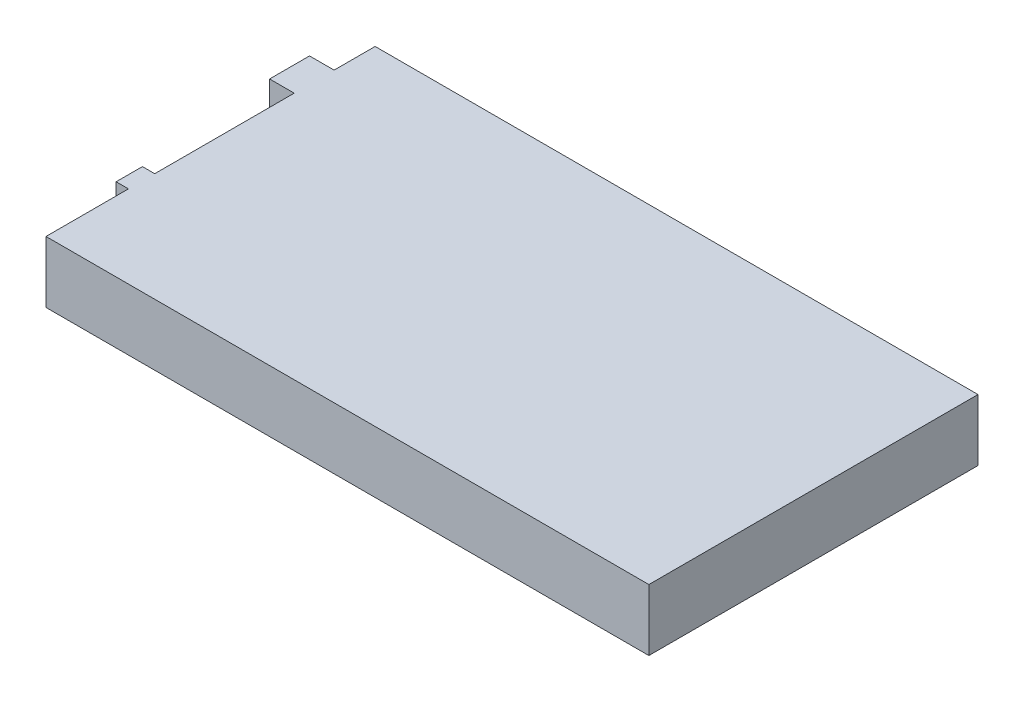
ISO-10303-21;
HEADER;
FILE_DESCRIPTION(('STEP AP214'),'2;1');
FILE_NAME('part.step','',(''),(''),'','','');
FILE_SCHEMA(('AUTOMOTIVE_DESIGN { 1 0 10303 214 1 1 1 1 }'));
ENDSEC;
DATA;
#1=APPLICATION_CONTEXT('core data for automotive mechanical design processes');
#2=APPLICATION_PROTOCOL_DEFINITION('international standard','automotive_design',2000,#1);
#3=PRODUCT_CONTEXT('',#1,'mechanical');
#4=PRODUCT('Part','Part','',(#3));
#5=PRODUCT_RELATED_PRODUCT_CATEGORY('part','',(#4));
#6=PRODUCT_DEFINITION_FORMATION('','',#4);
#7=PRODUCT_DEFINITION_CONTEXT('part definition',#1,'design');
#8=PRODUCT_DEFINITION('design','',#6,#7);
#9=PRODUCT_DEFINITION_SHAPE('','',#8);
#10=(LENGTH_UNIT() NAMED_UNIT(*) SI_UNIT(.MILLI.,.METRE.));
#11=(NAMED_UNIT(*) PLANE_ANGLE_UNIT() SI_UNIT($,.RADIAN.));
#12=(NAMED_UNIT(*) SI_UNIT($,.STERADIAN.) SOLID_ANGLE_UNIT());
#13=UNCERTAINTY_MEASURE_WITH_UNIT(LENGTH_MEASURE(1.E-05),#10,'distance_accuracy_value','');
#14=(GEOMETRIC_REPRESENTATION_CONTEXT(3) GLOBAL_UNCERTAINTY_ASSIGNED_CONTEXT((#13)) GLOBAL_UNIT_ASSIGNED_CONTEXT((#10,
#11,#12)) REPRESENTATION_CONTEXT('',''));
#15=CARTESIAN_POINT('',(0.,0.,0.));
#16=DIRECTION('',(0.,0.,1.));
#17=DIRECTION('',(1.,0.,0.));
#18=AXIS2_PLACEMENT_3D('',#15,#16,#17);
#19=CARTESIAN_POINT('',(-49.,10.,-26.75));
#20=DIRECTION('',(1.,0.,0.));
#21=DIRECTION('',(0.,0.,-1.));
#22=AXIS2_PLACEMENT_3D('',#19,#20,#21);
#23=PLANE('',#22);
#24=DIRECTION('',(0.,0.,1.));
#25=VECTOR('',#24,1.);
#26=CARTESIAN_POINT('',(-49.,0.,-26.75));
#27=LINE('',#26,#25);
#28=CARTESIAN_POINT('',(-49.,0.,-13.5956084483653));
#29=VERTEX_POINT('',#28);
#30=CARTESIAN_POINT('',(-49.,0.,9.07743041416528));
#31=VERTEX_POINT('',#30);
#32=EDGE_CURVE('E234',#29,#31,#27,.T.);
#33=ORIENTED_EDGE('',*,*,#32,.T.);
#34=DIRECTION('',(0.,1.,0.));
#35=VECTOR('',#34,1.);
#36=CARTESIAN_POINT('',(-49.,10.,9.07743041416529));
#37=LINE('',#36,#35);
#38=CARTESIAN_POINT('',(-49.,10.,9.07743041416528));
#39=VERTEX_POINT('',#38);
#40=EDGE_CURVE('E63',#31,#39,#37,.T.);
#41=ORIENTED_EDGE('',*,*,#40,.T.);
#42=DIRECTION('',(0.,0.,1.));
#43=VECTOR('',#42,1.);
#44=CARTESIAN_POINT('',(-49.,10.,-26.75));
#45=LINE('',#44,#43);
#46=CARTESIAN_POINT('',(-49.,10.,-13.5956084483653));
#47=VERTEX_POINT('',#46);
#48=EDGE_CURVE('E220',#47,#39,#45,.T.);
#49=ORIENTED_EDGE('',*,*,#48,.F.);
#50=DIRECTION('',(0.,-1.,0.));
#51=VECTOR('',#50,1.);
#52=CARTESIAN_POINT('',(-49.,10.,-13.5956084483653));
#53=LINE('',#52,#51);
#54=EDGE_CURVE('E202',#47,#29,#53,.T.);
#55=ORIENTED_EDGE('',*,*,#54,.T.);
#56=EDGE_LOOP('',(#33,#41,#49,#55));
#57=FACE_BOUND('',#56,.T.);
#58=ADVANCED_FACE('F39',(#57),#23,.F.);
#59=CARTESIAN_POINT('',(-49.,10.,13.3491623737725));
#60=VERTEX_POINT('',#59);
#61=CARTESIAN_POINT('',(-49.,10.,26.75));
#62=VERTEX_POINT('',#61);
#63=EDGE_CURVE('E55',#60,#62,#45,.T.);
#64=ORIENTED_EDGE('',*,*,#63,.F.);
#65=DIRECTION('',(0.,-1.,0.));
#66=VECTOR('',#65,1.);
#67=CARTESIAN_POINT('',(-49.,10.,13.3491623737725));
#68=LINE('',#67,#66);
#69=CARTESIAN_POINT('',(-49.,0.,13.3491623737725));
#70=VERTEX_POINT('',#69);
#71=EDGE_CURVE('E147',#60,#70,#68,.T.);
#72=ORIENTED_EDGE('',*,*,#71,.T.);
#73=CARTESIAN_POINT('',(-49.,0.,26.75));
#74=VERTEX_POINT('',#73);
#75=EDGE_CURVE('E230',#70,#74,#27,.T.);
#76=ORIENTED_EDGE('',*,*,#75,.T.);
#77=DIRECTION('',(0.,-1.,0.));
#78=VECTOR('',#77,1.);
#79=CARTESIAN_POINT('',(-49.,10.,26.75));
#80=LINE('',#79,#78);
#81=EDGE_CURVE('E240',#62,#74,#80,.T.);
#82=ORIENTED_EDGE('',*,*,#81,.F.);
#83=EDGE_LOOP('',(#64,#72,#76,#82));
#84=FACE_BOUND('',#83,.T.);
#85=ADVANCED_FACE('F271',(#84),#23,.F.);
#86=CARTESIAN_POINT('',(49.,10.,-26.75));
#87=DIRECTION('',(-1.,0.,0.));
#88=DIRECTION('',(0.,0.,1.));
#89=AXIS2_PLACEMENT_3D('',#86,#87,#88);
#90=PLANE('',#89);
#91=DIRECTION('',(0.,0.,-1.));
#92=VECTOR('',#91,1.);
#93=CARTESIAN_POINT('',(49.,0.,-26.75));
#94=LINE('',#93,#92);
#95=CARTESIAN_POINT('',(49.,0.,26.75));
#96=VERTEX_POINT('',#95);
#97=CARTESIAN_POINT('',(49.,0.,-26.75));
#98=VERTEX_POINT('',#97);
#99=EDGE_CURVE('E206',#96,#98,#94,.T.);
#100=ORIENTED_EDGE('',*,*,#99,.T.);
#101=DIRECTION('',(0.,-1.,0.));
#102=VECTOR('',#101,1.);
#103=CARTESIAN_POINT('',(49.,10.,-26.75));
#104=LINE('',#103,#102);
#105=CARTESIAN_POINT('',(49.,10.,-26.75));
#106=VERTEX_POINT('',#105);
#107=EDGE_CURVE('E11',#106,#98,#104,.T.);
#108=ORIENTED_EDGE('',*,*,#107,.F.);
#109=DIRECTION('',(0.,0.,-1.));
#110=VECTOR('',#109,1.);
#111=CARTESIAN_POINT('',(49.,10.,-26.75));
#112=LINE('',#111,#110);
#113=CARTESIAN_POINT('',(49.,10.,26.75));
#114=VERTEX_POINT('',#113);
#115=EDGE_CURVE('E207',#114,#106,#112,.T.);
#116=ORIENTED_EDGE('',*,*,#115,.F.);
#117=DIRECTION('',(0.,-1.,0.));
#118=VECTOR('',#117,1.);
#119=CARTESIAN_POINT('',(49.,10.,26.75));
#120=LINE('',#119,#118);
#121=EDGE_CURVE('E223',#114,#96,#120,.T.);
#122=ORIENTED_EDGE('',*,*,#121,.T.);
#123=EDGE_LOOP('',(#100,#108,#116,#122));
#124=FACE_BOUND('',#123,.T.);
#125=ADVANCED_FACE('F41',(#124),#90,.F.);
#126=CARTESIAN_POINT('',(-49.,10.,-26.75));
#127=DIRECTION('',(0.,0.,1.));
#128=DIRECTION('',(1.,0.,0.));
#129=AXIS2_PLACEMENT_3D('',#126,#127,#128);
#130=PLANE('',#129);
#131=DIRECTION('',(-1.,0.,0.));
#132=VECTOR('',#131,1.);
#133=CARTESIAN_POINT('',(-49.,0.,-26.75));
#134=LINE('',#133,#132);
#135=CARTESIAN_POINT('',(-49.,0.,-26.75));
#136=VERTEX_POINT('',#135);
#137=EDGE_CURVE('E227',#98,#136,#134,.T.);
#138=ORIENTED_EDGE('',*,*,#137,.T.);
#139=DIRECTION('',(0.,-1.,0.));
#140=VECTOR('',#139,1.);
#141=CARTESIAN_POINT('',(-49.,10.,-26.75));
#142=LINE('',#141,#140);
#143=CARTESIAN_POINT('',(-49.,10.,-26.75));
#144=VERTEX_POINT('',#143);
#145=EDGE_CURVE('E48',#144,#136,#142,.T.);
#146=ORIENTED_EDGE('',*,*,#145,.F.);
#147=DIRECTION('',(-1.,0.,0.));
#148=VECTOR('',#147,1.);
#149=CARTESIAN_POINT('',(-49.,10.,-26.75));
#150=LINE('',#149,#148);
#151=EDGE_CURVE('E211',#106,#144,#150,.T.);
#152=ORIENTED_EDGE('',*,*,#151,.F.);
#153=ORIENTED_EDGE('',*,*,#107,.T.);
#154=EDGE_LOOP('',(#138,#146,#152,#153));
#155=FACE_BOUND('',#154,.T.);
#156=ADVANCED_FACE('F264',(#155),#130,.F.);
#157=CARTESIAN_POINT('',(-49.,0.,-20.0853550793071));
#158=VERTEX_POINT('',#157);
#159=EDGE_CURVE('E231',#136,#158,#27,.T.);
#160=ORIENTED_EDGE('',*,*,#159,.T.);
#161=DIRECTION('',(0.,1.,0.));
#162=VECTOR('',#161,1.);
#163=CARTESIAN_POINT('',(-49.,10.,-20.085355079307));
#164=LINE('',#163,#162);
#165=CARTESIAN_POINT('',(-49.,10.,-20.0853550793071));
#166=VERTEX_POINT('',#165);
#167=EDGE_CURVE('E199',#158,#166,#164,.T.);
#168=ORIENTED_EDGE('',*,*,#167,.T.);
#169=EDGE_CURVE('E215',#144,#166,#45,.T.);
#170=ORIENTED_EDGE('',*,*,#169,.F.);
#171=ORIENTED_EDGE('',*,*,#145,.T.);
#172=EDGE_LOOP('',(#160,#168,#170,#171));
#173=FACE_BOUND('',#172,.T.);
#174=ADVANCED_FACE('F249',(#173),#23,.F.);
#175=CARTESIAN_POINT('',(-49.,10.,26.75));
#176=DIRECTION('',(0.,0.,-1.));
#177=DIRECTION('',(-1.,0.,0.));
#178=AXIS2_PLACEMENT_3D('',#175,#176,#177);
#179=PLANE('',#178);
#180=DIRECTION('',(1.,0.,0.));
#181=VECTOR('',#180,1.);
#182=CARTESIAN_POINT('',(-49.,0.,26.75));
#183=LINE('',#182,#181);
#184=EDGE_CURVE('E212',#74,#96,#183,.T.);
#185=ORIENTED_EDGE('',*,*,#184,.T.);
#186=ORIENTED_EDGE('',*,*,#121,.F.);
#187=DIRECTION('',(1.,0.,0.));
#188=VECTOR('',#187,1.);
#189=CARTESIAN_POINT('',(-49.,10.,26.75));
#190=LINE('',#189,#188);
#191=EDGE_CURVE('E219',#62,#114,#190,.T.);
#192=ORIENTED_EDGE('',*,*,#191,.F.);
#193=ORIENTED_EDGE('',*,*,#81,.T.);
#194=EDGE_LOOP('',(#185,#186,#192,#193));
#195=FACE_BOUND('',#194,.T.);
#196=ADVANCED_FACE('F269',(#195),#179,.F.);
#197=CARTESIAN_POINT('',(0.,10.,0.));
#198=DIRECTION('',(0.,1.,0.));
#199=DIRECTION('',(0.,0.,1.));
#200=AXIS2_PLACEMENT_3D('',#197,#198,#199);
#201=PLANE('',#200);
#202=ORIENTED_EDGE('',*,*,#48,.T.);
#203=DIRECTION('',(-1.,0.,0.));
#204=VECTOR('',#203,1.);
#205=CARTESIAN_POINT('',(-51.,10.,9.07743041416529));
#206=LINE('',#205,#204);
#207=CARTESIAN_POINT('',(-51.,10.,9.07743041416529));
#208=VERTEX_POINT('',#207);
#209=EDGE_CURVE('E142',#39,#208,#206,.T.);
#210=ORIENTED_EDGE('',*,*,#209,.T.);
#211=DIRECTION('',(0.,0.,1.));
#212=VECTOR('',#211,1.);
#213=CARTESIAN_POINT('',(-51.,10.,9.07743041416529));
#214=LINE('',#213,#212);
#215=CARTESIAN_POINT('',(-51.,10.,13.3491623737725));
#216=VERTEX_POINT('',#215);
#217=EDGE_CURVE('E136',#208,#216,#214,.T.);
#218=ORIENTED_EDGE('',*,*,#217,.T.);
#219=DIRECTION('',(1.,0.,0.));
#220=VECTOR('',#219,1.);
#221=CARTESIAN_POINT('',(-51.,10.,13.3491623737725));
#222=LINE('',#221,#220);
#223=EDGE_CURVE('E145',#216,#60,#222,.T.);
#224=ORIENTED_EDGE('',*,*,#223,.T.);
#225=ORIENTED_EDGE('',*,*,#63,.T.);
#226=ORIENTED_EDGE('',*,*,#191,.T.);
#227=ORIENTED_EDGE('',*,*,#115,.T.);
#228=ORIENTED_EDGE('',*,*,#151,.T.);
#229=ORIENTED_EDGE('',*,*,#169,.T.);
#230=DIRECTION('',(-1.,0.,0.));
#231=VECTOR('',#230,1.);
#232=CARTESIAN_POINT('',(-42.2385214094511,10.,-20.085355079307));
#233=LINE('',#232,#231);
#234=CARTESIAN_POINT('',(-53.,10.,-20.085355079307));
#235=VERTEX_POINT('',#234);
#236=EDGE_CURVE('E171',#166,#235,#233,.T.);
#237=ORIENTED_EDGE('',*,*,#236,.T.);
#238=DIRECTION('',(0.,0.,1.));
#239=VECTOR('',#238,1.);
#240=CARTESIAN_POINT('',(-53.,10.,-20.085355079307));
#241=LINE('',#240,#239);
#242=CARTESIAN_POINT('',(-53.,10.,-13.5956084483653));
#243=VERTEX_POINT('',#242);
#244=EDGE_CURVE('E182',#235,#243,#241,.T.);
#245=ORIENTED_EDGE('',*,*,#244,.T.);
#246=DIRECTION('',(1.,0.,0.));
#247=VECTOR('',#246,1.);
#248=CARTESIAN_POINT('',(-42.2385214094511,10.,-13.5956084483653));
#249=LINE('',#248,#247);
#250=EDGE_CURVE('E186',#243,#47,#249,.T.);
#251=ORIENTED_EDGE('',*,*,#250,.T.);
#252=EDGE_LOOP('',(#202,#210,#218,#224,#225,#226,#227,#228,#229,#237,#245,#251));
#253=FACE_BOUND('',#252,.T.);
#254=ADVANCED_FACE('F151',(#253),#201,.T.);
#255=CARTESIAN_POINT('',(0.,0.,0.));
#256=DIRECTION('',(0.,1.,0.));
#257=DIRECTION('',(0.,0.,1.));
#258=AXIS2_PLACEMENT_3D('',#255,#256,#257);
#259=PLANE('',#258);
#260=ORIENTED_EDGE('',*,*,#75,.F.);
#261=DIRECTION('',(-1.,0.,0.));
#262=VECTOR('',#261,1.);
#263=CARTESIAN_POINT('',(-51.,0.,13.3491623737725));
#264=LINE('',#263,#262);
#265=CARTESIAN_POINT('',(-51.,0.,13.3491623737725));
#266=VERTEX_POINT('',#265);
#267=EDGE_CURVE('E164',#70,#266,#264,.T.);
#268=ORIENTED_EDGE('',*,*,#267,.T.);
#269=DIRECTION('',(0.,0.,-1.));
#270=VECTOR('',#269,1.);
#271=CARTESIAN_POINT('',(-51.,0.,9.07743041416529));
#272=LINE('',#271,#270);
#273=CARTESIAN_POINT('',(-51.,0.,9.07743041416529));
#274=VERTEX_POINT('',#273);
#275=EDGE_CURVE('E137',#266,#274,#272,.T.);
#276=ORIENTED_EDGE('',*,*,#275,.T.);
#277=DIRECTION('',(1.,0.,0.));
#278=VECTOR('',#277,1.);
#279=CARTESIAN_POINT('',(-51.,0.,9.07743041416529));
#280=LINE('',#279,#278);
#281=EDGE_CURVE('E162',#274,#31,#280,.T.);
#282=ORIENTED_EDGE('',*,*,#281,.T.);
#283=ORIENTED_EDGE('',*,*,#32,.F.);
#284=DIRECTION('',(-1.,0.,0.));
#285=VECTOR('',#284,1.);
#286=CARTESIAN_POINT('',(-42.2385214094511,0.,-13.5956084483653));
#287=LINE('',#286,#285);
#288=CARTESIAN_POINT('',(-53.,0.,-13.5956084483653));
#289=VERTEX_POINT('',#288);
#290=EDGE_CURVE('E175',#29,#289,#287,.T.);
#291=ORIENTED_EDGE('',*,*,#290,.T.);
#292=DIRECTION('',(0.,0.,-1.));
#293=VECTOR('',#292,1.);
#294=CARTESIAN_POINT('',(-53.,0.,-20.085355079307));
#295=LINE('',#294,#293);
#296=CARTESIAN_POINT('',(-53.,0.,-20.085355079307));
#297=VERTEX_POINT('',#296);
#298=EDGE_CURVE('E172',#289,#297,#295,.T.);
#299=ORIENTED_EDGE('',*,*,#298,.T.);
#300=DIRECTION('',(1.,0.,0.));
#301=VECTOR('',#300,1.);
#302=CARTESIAN_POINT('',(-42.2385214094511,0.,-20.085355079307));
#303=LINE('',#302,#301);
#304=EDGE_CURVE('E179',#297,#158,#303,.T.);
#305=ORIENTED_EDGE('',*,*,#304,.T.);
#306=ORIENTED_EDGE('',*,*,#159,.F.);
#307=ORIENTED_EDGE('',*,*,#137,.F.);
#308=ORIENTED_EDGE('',*,*,#99,.F.);
#309=ORIENTED_EDGE('',*,*,#184,.F.);
#310=EDGE_LOOP('',(#260,#268,#276,#282,#283,#291,#299,#305,#306,#307,#308,#309));
#311=FACE_BOUND('',#310,.T.);
#312=ADVANCED_FACE('F253',(#311),#259,.F.);
#313=CARTESIAN_POINT('',(-42.2385214094511,-12.5668704452884,-13.5956084483653));
#314=DIRECTION('',(0.,0.,1.));
#315=DIRECTION('',(1.,0.,0.));
#316=AXIS2_PLACEMENT_3D('',#313,#314,#315);
#317=PLANE('',#316);
#318=ORIENTED_EDGE('',*,*,#54,.F.);
#319=ORIENTED_EDGE('',*,*,#250,.F.);
#320=DIRECTION('',(0.,1.,0.));
#321=VECTOR('',#320,1.);
#322=CARTESIAN_POINT('',(-53.,-12.5668704452884,-13.5956084483653));
#323=LINE('',#322,#321);
#324=EDGE_CURVE('E176',#289,#243,#323,.T.);
#325=ORIENTED_EDGE('',*,*,#324,.F.);
#326=ORIENTED_EDGE('',*,*,#290,.F.);
#327=EDGE_LOOP('',(#318,#319,#325,#326));
#328=FACE_BOUND('',#327,.T.);
#329=ADVANCED_FACE('F341',(#328),#317,.T.);
#330=CARTESIAN_POINT('',(-42.2385214094511,-12.5668704452884,-20.085355079307));
#331=DIRECTION('',(0.,0.,-1.));
#332=DIRECTION('',(-1.,0.,0.));
#333=AXIS2_PLACEMENT_3D('',#330,#331,#332);
#334=PLANE('',#333);
#335=ORIENTED_EDGE('',*,*,#167,.F.);
#336=ORIENTED_EDGE('',*,*,#304,.F.);
#337=DIRECTION('',(0.,1.,0.));
#338=VECTOR('',#337,1.);
#339=CARTESIAN_POINT('',(-53.,-12.5668704452884,-20.085355079307));
#340=LINE('',#339,#338);
#341=EDGE_CURVE('E190',#297,#235,#340,.T.);
#342=ORIENTED_EDGE('',*,*,#341,.T.);
#343=ORIENTED_EDGE('',*,*,#236,.F.);
#344=EDGE_LOOP('',(#335,#336,#342,#343));
#345=FACE_BOUND('',#344,.T.);
#346=ADVANCED_FACE('F259',(#345),#334,.T.);
#347=CARTESIAN_POINT('',(-53.,-12.5668704452884,-20.085355079307));
#348=DIRECTION('',(-1.,0.,0.));
#349=DIRECTION('',(0.,0.,1.));
#350=AXIS2_PLACEMENT_3D('',#347,#348,#349);
#351=PLANE('',#350);
#352=ORIENTED_EDGE('',*,*,#298,.F.);
#353=ORIENTED_EDGE('',*,*,#324,.T.);
#354=ORIENTED_EDGE('',*,*,#244,.F.);
#355=ORIENTED_EDGE('',*,*,#341,.F.);
#356=EDGE_LOOP('',(#352,#353,#354,#355));
#357=FACE_BOUND('',#356,.T.);
#358=ADVANCED_FACE('F283',(#357),#351,.T.);
#359=CARTESIAN_POINT('',(-51.,-12.5668704452884,9.07743041416529));
#360=DIRECTION('',(0.,0.,-1.));
#361=DIRECTION('',(-1.,0.,0.));
#362=AXIS2_PLACEMENT_3D('',#359,#360,#361);
#363=PLANE('',#362);
#364=ORIENTED_EDGE('',*,*,#40,.F.);
#365=ORIENTED_EDGE('',*,*,#281,.F.);
#366=DIRECTION('',(0.,1.,0.));
#367=VECTOR('',#366,1.);
#368=CARTESIAN_POINT('',(-51.,-12.5668704452884,9.07743041416529));
#369=LINE('',#368,#367);
#370=EDGE_CURVE('E141',#274,#208,#369,.T.);
#371=ORIENTED_EDGE('',*,*,#370,.T.);
#372=ORIENTED_EDGE('',*,*,#209,.F.);
#373=EDGE_LOOP('',(#364,#365,#371,#372));
#374=FACE_BOUND('',#373,.T.);
#375=ADVANCED_FACE('F279',(#374),#363,.T.);
#376=CARTESIAN_POINT('',(-51.,-12.5668704452884,13.3491623737725));
#377=DIRECTION('',(0.,0.,1.));
#378=DIRECTION('',(1.,0.,0.));
#379=AXIS2_PLACEMENT_3D('',#376,#377,#378);
#380=PLANE('',#379);
#381=ORIENTED_EDGE('',*,*,#71,.F.);
#382=ORIENTED_EDGE('',*,*,#223,.F.);
#383=DIRECTION('',(0.,1.,0.));
#384=VECTOR('',#383,1.);
#385=CARTESIAN_POINT('',(-51.,-12.5668704452884,13.3491623737725));
#386=LINE('',#385,#384);
#387=EDGE_CURVE('E131',#266,#216,#386,.T.);
#388=ORIENTED_EDGE('',*,*,#387,.F.);
#389=ORIENTED_EDGE('',*,*,#267,.F.);
#390=EDGE_LOOP('',(#381,#382,#388,#389));
#391=FACE_BOUND('',#390,.T.);
#392=ADVANCED_FACE('F146',(#391),#380,.T.);
#393=CARTESIAN_POINT('',(-51.,-12.5668704452884,9.07743041416529));
#394=DIRECTION('',(-1.,0.,0.));
#395=DIRECTION('',(0.,0.,1.));
#396=AXIS2_PLACEMENT_3D('',#393,#394,#395);
#397=PLANE('',#396);
#398=ORIENTED_EDGE('',*,*,#275,.F.);
#399=ORIENTED_EDGE('',*,*,#387,.T.);
#400=ORIENTED_EDGE('',*,*,#217,.F.);
#401=ORIENTED_EDGE('',*,*,#370,.F.);
#402=EDGE_LOOP('',(#398,#399,#400,#401));
#403=FACE_BOUND('',#402,.T.);
#404=ADVANCED_FACE('F133',(#403),#397,.T.);
#405=CLOSED_SHELL('',(#58,#85,#125,#156,#174,#196,#254,#312,#329,#346,#358,#375,#392,#404));
#406=MANIFOLD_SOLID_BREP('B2',#405);
#407=ADVANCED_BREP_SHAPE_REPRESENTATION('',(#18,#406),#14);
#408=SHAPE_DEFINITION_REPRESENTATION(#9,#407);
ENDSEC;
END-ISO-10303-21;
